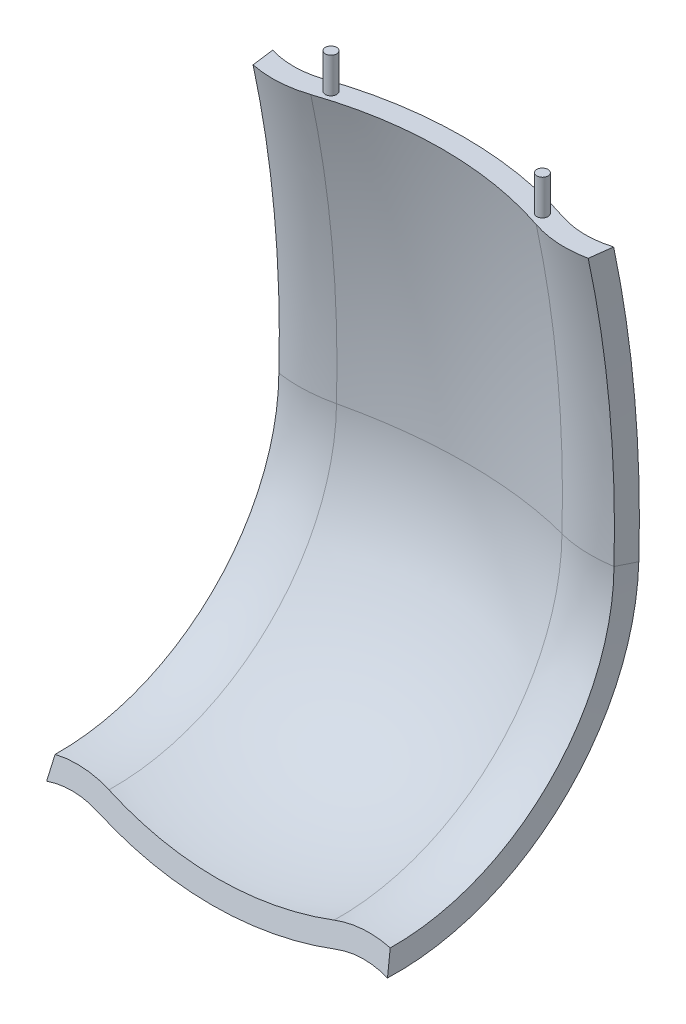
ISO-10303-21;
HEADER;
FILE_DESCRIPTION(('STEP AP214'),'2;1');
FILE_NAME('part.step','',(''),(''),'','','');
FILE_SCHEMA(('AUTOMOTIVE_DESIGN { 1 0 10303 214 1 1 1 1 }'));
ENDSEC;
DATA;
#1=APPLICATION_CONTEXT('core data for automotive mechanical design processes');
#2=APPLICATION_PROTOCOL_DEFINITION('international standard','automotive_design',2000,#1);
#3=PRODUCT_CONTEXT('',#1,'mechanical');
#4=PRODUCT('Part','Part','',(#3));
#5=PRODUCT_RELATED_PRODUCT_CATEGORY('part','',(#4));
#6=PRODUCT_DEFINITION_FORMATION('','',#4);
#7=PRODUCT_DEFINITION_CONTEXT('part definition',#1,'design');
#8=PRODUCT_DEFINITION('design','',#6,#7);
#9=PRODUCT_DEFINITION_SHAPE('','',#8);
#10=(LENGTH_UNIT() NAMED_UNIT(*) SI_UNIT(.MILLI.,.METRE.));
#11=(NAMED_UNIT(*) PLANE_ANGLE_UNIT() SI_UNIT($,.RADIAN.));
#12=(NAMED_UNIT(*) SI_UNIT($,.STERADIAN.) SOLID_ANGLE_UNIT());
#13=UNCERTAINTY_MEASURE_WITH_UNIT(LENGTH_MEASURE(1.E-05),#10,'distance_accuracy_value','');
#14=(GEOMETRIC_REPRESENTATION_CONTEXT(3) GLOBAL_UNCERTAINTY_ASSIGNED_CONTEXT((#13)) GLOBAL_UNIT_ASSIGNED_CONTEXT((#10,
#11,#12)) REPRESENTATION_CONTEXT('',''));
#15=CARTESIAN_POINT('',(0.,0.,0.));
#16=DIRECTION('',(0.,0.,1.));
#17=DIRECTION('',(1.,0.,0.));
#18=AXIS2_PLACEMENT_3D('',#15,#16,#17);
#19=CARTESIAN_POINT('',(-118.278717158602,-424.071503815942,169.727693219282));
#20=DIRECTION('',(0.,0.247759799276308,0.968821491226616));
#21=DIRECTION('',(0.,-0.968821491226616,0.247759799276308));
#22=AXIS2_PLACEMENT_3D('',#19,#20,#21);
#23=PLANE('',#22);
#24=CARTESIAN_POINT('',(-118.278717158602,-424.071503815942,169.727693219282));
#25=DIRECTION('',(0.,0.247759799276308,0.968821491226616));
#26=DIRECTION('',(0.,-0.968821491226616,0.247759799276308));
#27=AXIS2_PLACEMENT_3D('',#24,#25,#26);
#28=CIRCLE('',#27,59.5845550701935);
#29=CARTESIAN_POINT('',(-99.592921032926,-369.256749710492,155.709741927396));
#30=VERTEX_POINT('',#29);
#31=CARTESIAN_POINT('',(-135.591251757044,-368.835122514182,155.601917864374));
#32=VERTEX_POINT('',#31);
#33=EDGE_CURVE('E171',#30,#32,#28,.T.);
#34=ORIENTED_EDGE('',*,*,#33,.F.);
#35=CARTESIAN_POINT('',(-14.7418590538277,-126.038057965964,93.5106528355801));
#36=DIRECTION('',(0.,-0.247759799276308,-0.968821491226616));
#37=DIRECTION('',(0.,-0.968821491226616,0.247759799276308));
#38=AXIS2_PLACEMENT_3D('',#35,#36,#37);
#39=CIRCLE('',#38,264.997663040171);
#40=CARTESIAN_POINT('',(69.7900654553828,-369.361033084295,155.736410646036));
#41=VERTEX_POINT('',#40);
#42=EDGE_CURVE('E173',#41,#30,#39,.T.);
#43=ORIENTED_EDGE('',*,*,#42,.F.);
#44=CARTESIAN_POINT('',(88.7970903246977,-424.072266339678,169.7278882219));
#45=DIRECTION('',(0.,0.247759799276308,0.968821491226616));
#46=DIRECTION('',(0.,0.968821491226616,-0.247759799276308));
#47=AXIS2_PLACEMENT_3D('',#44,#45,#46);
#48=CIRCLE('',#47,59.5847923841612);
#49=CARTESIAN_POINT('',(106.171721078195,-368.853948331316,155.606732250426));
#50=VERTEX_POINT('',#49);
#51=EDGE_CURVE('E104',#50,#41,#48,.T.);
#52=ORIENTED_EDGE('',*,*,#51,.F.);
#53=DIRECTION('',(0.126241213779495,-0.961070507129327,0.245777615477199));
#54=VECTOR('',#53,1.);
#55=CARTESIAN_POINT('',(106.171721078195,-368.853948331316,155.606732250426));
#56=LINE('',#55,#54);
#57=CARTESIAN_POINT('',(104.135409966841,-353.351573996735,151.642260788734));
#58=VERTEX_POINT('',#57);
#59=EDGE_CURVE('E108',#58,#50,#56,.T.);
#60=ORIENTED_EDGE('',*,*,#59,.F.);
#61=CARTESIAN_POINT('',(88.7970903246977,-424.072266339678,169.7278882219));
#62=DIRECTION('',(0.,-0.247759799276308,-0.968821491226616));
#63=DIRECTION('',(0.,0.968821491226616,-0.247759799276308));
#64=AXIS2_PLACEMENT_3D('',#61,#62,#63);
#65=CIRCLE('',#64,74.5906850388244);
#66=CARTESIAN_POINT('',(65.0033176383462,-355.582502348779,152.212783187037));
#67=VERTEX_POINT('',#66);
#68=EDGE_CURVE('E113',#67,#58,#65,.T.);
#69=ORIENTED_EDGE('',*,*,#68,.F.);
#70=CARTESIAN_POINT('',(-14.7418590538277,-126.038057965964,93.5106528355801));
#71=DIRECTION('',(0.,0.247759799276308,0.968821491226616));
#72=DIRECTION('',(0.,-0.968821491226616,0.247759799276308));
#73=AXIS2_PLACEMENT_3D('',#70,#71,#72);
#74=CIRCLE('',#73,249.991770385508);
#75=CARTESIAN_POINT('',(-94.8062706017691,-355.478173938941,152.186102951189));
#76=VERTEX_POINT('',#75);
#77=EDGE_CURVE('E214',#76,#67,#74,.T.);
#78=ORIENTED_EDGE('',*,*,#77,.F.);
#79=CARTESIAN_POINT('',(-118.278717158602,-424.071503815942,169.727693219282));
#80=DIRECTION('',(0.,-0.247759799276308,-0.968821491226616));
#81=DIRECTION('',(0.,-0.968821491226616,0.247759799276308));
#82=AXIS2_PLACEMENT_3D('',#79,#80,#81);
#83=CIRCLE('',#82,74.5902677305294);
#84=CARTESIAN_POINT('',(-133.542450497735,-353.336079340013,151.638298290922));
#85=VERTEX_POINT('',#84);
#86=EDGE_CURVE('E164',#85,#76,#83,.T.);
#87=ORIENTED_EDGE('',*,*,#86,.F.);
#88=DIRECTION('',(0.127029944830027,0.960972954495393,-0.245752668032059));
#89=VECTOR('',#88,1.);
#90=CARTESIAN_POINT('',(-133.542450497735,-353.336079340013,151.638298290922));
#91=LINE('',#90,#89);
#92=EDGE_CURVE('E168',#32,#85,#91,.T.);
#93=ORIENTED_EDGE('',*,*,#92,.F.);
#94=EDGE_LOOP('',(#34,#43,#52,#60,#69,#78,#87,#93));
#95=FACE_BOUND('',#94,.T.);
#96=ADVANCED_FACE('F38',(#95),#23,.T.);
#97=CARTESIAN_POINT('',(-118.278717158602,0.,-61.7816368146099));
#98=DIRECTION('',(0.,-1.,0.));
#99=DIRECTION('',(0.,0.,-1.));
#100=AXIS2_PLACEMENT_3D('',#97,#98,#99);
#101=PLANE('',#100);
#102=CARTESIAN_POINT('',(60.3051011635703,0.,-0.141223037764587));
#103=DIRECTION('',(0.,-1.,0.));
#104=DIRECTION('',(0.,0.,-1.));
#105=AXIS2_PLACEMENT_3D('',#102,#103,#104);
#106=CIRCLE('',#105,4.00000000000001);
#107=CARTESIAN_POINT('',(60.3051011635703,0.,-4.14122303776459));
#108=VERTEX_POINT('',#107);
#109=EDGE_CURVE('E11',#108,#108,#106,.F.);
#110=ORIENTED_EDGE('',*,*,#109,.F.);
#111=EDGE_LOOP('',(#110));
#112=FACE_BOUND('',#111,.T.);
#113=CARTESIAN_POINT('',(-89.6435023296788,0.,-0.14072909963717));
#114=DIRECTION('',(0.,-1.,0.));
#115=DIRECTION('',(0.,0.,-1.));
#116=AXIS2_PLACEMENT_3D('',#113,#114,#115);
#117=CIRCLE('',#116,4.00000000000001);
#118=CARTESIAN_POINT('',(-89.6435023296788,0.,-4.14072909963718));
#119=VERTEX_POINT('',#118);
#120=EDGE_CURVE('E45',#119,#119,#117,.F.);
#121=ORIENTED_EDGE('',*,*,#120,.F.);
#122=EDGE_LOOP('',(#121));
#123=FACE_BOUND('',#122,.T.);
#124=CARTESIAN_POINT('',(-118.278717158602,0.,-61.7816368146099));
#125=DIRECTION('',(0.,-1.,0.));
#126=DIRECTION('',(0.,0.,-1.));
#127=AXIS2_PLACEMENT_3D('',#124,#125,#126);
#128=CIRCLE('',#127,59.5845550701935);
#129=CARTESIAN_POINT('',(-99.592921032926,0.,-5.20284020260518));
#130=VERTEX_POINT('',#129);
#131=CARTESIAN_POINT('',(-135.591251757044,0.,-4.76764424532323));
#132=VERTEX_POINT('',#131);
#133=EDGE_CURVE('E197',#130,#132,#128,.T.);
#134=ORIENTED_EDGE('',*,*,#133,.T.);
#135=DIRECTION('',(0.127029944830027,0.,0.991898882505914));
#136=VECTOR('',#135,1.);
#137=CARTESIAN_POINT('',(-133.542450497735,0.,11.2301874651869));
#138=LINE('',#137,#136);
#139=CARTESIAN_POINT('',(-133.542450497735,0.,11.2301874651869));
#140=VERTEX_POINT('',#139);
#141=EDGE_CURVE('E132',#132,#140,#138,.T.);
#142=ORIENTED_EDGE('',*,*,#141,.T.);
#143=CARTESIAN_POINT('',(-118.278717158602,0.,-61.7816368146099));
#144=DIRECTION('',(0.,1.,0.));
#145=DIRECTION('',(0.,0.,-1.));
#146=AXIS2_PLACEMENT_3D('',#143,#144,#145);
#147=CIRCLE('',#146,74.5902677305294);
#148=CARTESIAN_POINT('',(-94.8062706017691,0.,9.01915620883497));
#149=VERTEX_POINT('',#148);
#150=EDGE_CURVE('E128',#140,#149,#147,.T.);
#151=ORIENTED_EDGE('',*,*,#150,.T.);
#152=CARTESIAN_POINT('',(-14.7418590538277,0.,245.843089256073));
#153=DIRECTION('',(0.,-1.,0.));
#154=DIRECTION('',(0.,0.,-1.));
#155=AXIS2_PLACEMENT_3D('',#152,#153,#154);
#156=CIRCLE('',#155,249.991770385508);
#157=CARTESIAN_POINT('',(65.0033176383462,0.,8.91147031336038));
#158=VERTEX_POINT('',#157);
#159=EDGE_CURVE('E123',#149,#158,#156,.T.);
#160=ORIENTED_EDGE('',*,*,#159,.T.);
#161=CARTESIAN_POINT('',(88.7970903246977,0.,-61.7824238778026));
#162=DIRECTION('',(0.,1.,0.));
#163=DIRECTION('',(0.,0.,1.));
#164=AXIS2_PLACEMENT_3D('',#161,#162,#163);
#165=CIRCLE('',#164,74.5906850388244);
#166=CARTESIAN_POINT('',(104.135409966841,0.,11.2141941610939));
#167=VERTEX_POINT('',#166);
#168=EDGE_CURVE('E232',#158,#167,#165,.T.);
#169=ORIENTED_EDGE('',*,*,#168,.T.);
#170=DIRECTION('',(0.126241213779495,0.,-0.991999574568195));
#171=VECTOR('',#170,1.);
#172=CARTESIAN_POINT('',(106.171721078195,0.,-4.78707591287451));
#173=LINE('',#172,#171);
#174=CARTESIAN_POINT('',(106.171721078195,0.,-4.78707591287458));
#175=VERTEX_POINT('',#174);
#176=EDGE_CURVE('E58',#167,#175,#173,.T.);
#177=ORIENTED_EDGE('',*,*,#176,.T.);
#178=CARTESIAN_POINT('',(88.7970903246977,0.,-61.7824238778026));
#179=DIRECTION('',(0.,-1.,0.));
#180=DIRECTION('',(0.,0.,1.));
#181=AXIS2_PLACEMENT_3D('',#178,#179,#180);
#182=CIRCLE('',#181,59.5847923841612);
#183=CARTESIAN_POINT('',(69.7900654553828,0.,-5.31047961270002));
#184=VERTEX_POINT('',#183);
#185=EDGE_CURVE('E52',#175,#184,#182,.T.);
#186=ORIENTED_EDGE('',*,*,#185,.T.);
#187=CARTESIAN_POINT('',(-14.7418590538277,0.,245.843089256073));
#188=DIRECTION('',(0.,1.,0.));
#189=DIRECTION('',(0.,0.,-1.));
#190=AXIS2_PLACEMENT_3D('',#187,#188,#189);
#191=CIRCLE('',#190,264.997663040171);
#192=EDGE_CURVE('E254',#184,#130,#191,.T.);
#193=ORIENTED_EDGE('',*,*,#192,.T.);
#194=EDGE_LOOP('',(#134,#142,#151,#160,#169,#177,#186,#193));
#195=FACE_BOUND('',#194,.T.);
#196=ADVANCED_FACE('F262',(#112,#123,#195),#101,.F.);
#197=CARTESIAN_POINT('',(-99.592921032926,-369.256749710492,155.709741927396));
#198=CARTESIAN_POINT('',(-99.592921032926,-373.333889627721,54.1518202161446));
#199=CARTESIAN_POINT('',(-99.592921032926,-303.97058147765,-20.1406155676662));
#200=CARTESIAN_POINT('',(-99.592921032926,-202.372049393952,-23.0341965067791));
#201=CARTESIAN_POINT('',(-111.354236849151,-365.4935473196,154.747366218923));
#202=CARTESIAN_POINT('',(-111.354236849151,-369.001718573605,55.4142972496257));
#203=CARTESIAN_POINT('',(-111.354236849151,-300.82078636074,-16.9094632927526));
#204=CARTESIAN_POINT('',(-111.354236849151,-201.453585225683,-19.2600366253375));
#205=CARTESIAN_POINT('',(-123.739469592964,-365.348486400041,154.710269328899));
#206=CARTESIAN_POINT('',(-123.739469592964,-368.834725504532,55.4629622057922));
#207=CARTESIAN_POINT('',(-123.739469592964,-300.699370574763,-16.7849114160405));
#208=CARTESIAN_POINT('',(-123.739469592964,-201.418181002633,-19.1145533251865));
#209=CARTESIAN_POINT('',(-135.591251757044,-368.835122514182,155.601917864374));
#210=CARTESIAN_POINT('',(-135.591251757044,-372.848515484703,54.2932674721626));
#211=CARTESIAN_POINT('',(-135.591251757044,-303.617680106385,-19.7785989836475));
#212=CARTESIAN_POINT('',(-135.591251757044,-202.269145156562,-22.6113416390504));
#213=(BOUNDED_SURFACE() B_SPLINE_SURFACE(3,3,((#197,#198,#199,#200),(#201,#202,#203,#204),(#205,
#206,#207,#208),(#209,#210,#211,#212)),.UNSPECIFIED.,.F.,.F.,
.F.) B_SPLINE_SURFACE_WITH_KNOTS((4,4),(4,4),(0.,1.),(0.,1.),
.UNSPECIFIED.) GEOMETRIC_REPRESENTATION_ITEM() RATIONAL_B_SPLINE_SURFACE(((1.,0.801983569158669,
0.801983569158669,1.),(0.968850874498109,0.777002482312491,0.777002482312491,0.968850874498109),
(0.968850874498109,0.777002482312491,0.777002482312491,0.968850874498109),(1.,0.801983569158669,
0.801983569158669,1.))) REPRESENTATION_ITEM('') SURFACE());
#214=CARTESIAN_POINT('',(-135.591251757044,-197.477734141993,148.813509023892));
#215=DIRECTION('',(1.,0.,0.));
#216=DIRECTION('',(0.,-0.999216228439356,0.0395844517888995));
#217=AXIS2_PLACEMENT_3D('',#214,#215,#216);
#218=CIRCLE('',#217,171.491798766946);
#219=CARTESIAN_POINT('',(-135.591251757044,-202.269145156562,-22.6113416390504));
#220=VERTEX_POINT('',#219);
#221=EDGE_CURVE('E193',#32,#220,#218,.T.);
#222=CARTESIAN_POINT('',(-118.278717158602,-215.750385797051,-78.0085572683933));
#223=DIRECTION('',(0.,-0.9716424535963,0.23645494786399));
#224=DIRECTION('',(0.,-0.23645494786399,-0.9716424535963));
#225=AXIS2_PLACEMENT_3D('',#222,#223,#224);
#226=CIRCLE('',#225,59.5845550701935);
#227=CARTESIAN_POINT('',(-99.592921032926,-202.372049393952,-23.0341965067791));
#228=VERTEX_POINT('',#227);
#229=EDGE_CURVE('E191',#228,#220,#226,.T.);
#230=CARTESIAN_POINT('',(-99.592921032926,-197.477734141993,148.813509023892));
#231=DIRECTION('',(1.,0.,0.));
#232=DIRECTION('',(0.,-0.99919512386668,0.0401136440759395));
#233=AXIS2_PLACEMENT_3D('',#230,#231,#232);
#234=CIRCLE('',#233,171.917387770818);
#235=EDGE_CURVE('E184',#30,#228,#234,.T.);
#236=ORIENTED_EDGE('',*,*,#221,.T.);
#237=ORIENTED_EDGE('',*,*,#229,.F.);
#238=ORIENTED_EDGE('',*,*,#235,.F.);
#239=ORIENTED_EDGE('',*,*,#33,.T.);
#240=EDGE_LOOP('',(#236,#237,#238,#239));
#241=FACE_BOUND('',#240,.T.);
#242=ADVANCED_FACE('F189',(#241),#213,.T.);
#243=CARTESIAN_POINT('',(-135.591251757044,-368.835122514182,155.601917864374));
#244=CARTESIAN_POINT('',(-135.591251757044,-372.848515484703,54.2932674721626));
#245=CARTESIAN_POINT('',(-135.591251757044,-303.617680106385,-19.7785989836475));
#246=CARTESIAN_POINT('',(-135.591251757044,-202.269145156562,-22.6113416390504));
#247=CARTESIAN_POINT('',(-133.542450497735,-353.336079340013,151.638298290922));
#248=CARTESIAN_POINT('',(-133.542450497735,-355.006130401154,59.4928778082094));
#249=CARTESIAN_POINT('',(-133.542450497735,-290.645002733271,-6.47084579652049));
#250=CARTESIAN_POINT('',(-133.542450497735,-198.486378693517,-7.06716918362965));
#251=(BOUNDED_SURFACE() B_SPLINE_SURFACE(1,3,((#243,#244,#245,#246),(#247,#248,#249,#250)),
.UNSPECIFIED.,.F.,.F.,.F.) B_SPLINE_SURFACE_WITH_KNOTS((2,2),(4,4),(0.,1.),(0.,1.),
.UNSPECIFIED.) GEOMETRIC_REPRESENTATION_ITEM() RATIONAL_B_SPLINE_SURFACE(((1.,0.801983569158669,
0.801983569158669,1.),(1.,0.801983569158669,0.801983569158669,1.))) REPRESENTATION_ITEM('') SURFACE());
#252=CARTESIAN_POINT('',(-133.542450497735,-197.477734141993,148.813509023892));
#253=DIRECTION('',(1.,0.,0.));
#254=DIRECTION('',(0.,-0.999835799296297,0.0181211049755204));
#255=AXIS2_PLACEMENT_3D('',#252,#253,#254);
#256=CIRCLE('',#255,155.883941450902);
#257=CARTESIAN_POINT('',(-133.542450497735,-198.486378693517,-7.06716918362957));
#258=VERTEX_POINT('',#257);
#259=EDGE_CURVE('E207',#85,#258,#256,.T.);
#260=DIRECTION('',(0.127029944830027,0.234539398549286,0.963771063917474));
#261=VECTOR('',#260,1.);
#262=CARTESIAN_POINT('',(-133.542450497735,-198.486378693517,-7.06716918362962));
#263=LINE('',#262,#261);
#264=EDGE_CURVE('E205',#220,#258,#263,.T.);
#265=ORIENTED_EDGE('',*,*,#259,.T.);
#266=ORIENTED_EDGE('',*,*,#264,.F.);
#267=ORIENTED_EDGE('',*,*,#221,.F.);
#268=ORIENTED_EDGE('',*,*,#92,.T.);
#269=EDGE_LOOP('',(#265,#266,#267,#268));
#270=FACE_BOUND('',#269,.T.);
#271=ADVANCED_FACE('F400',(#270),#251,.T.);
#272=CARTESIAN_POINT('',(-133.542450497735,-353.336079340013,151.638298290922));
#273=CARTESIAN_POINT('',(-133.542450497735,-355.006130401154,59.4928778082094));
#274=CARTESIAN_POINT('',(-133.542450497735,-290.645002733271,-6.47084579652049));
#275=CARTESIAN_POINT('',(-133.542450497735,-198.486378693517,-7.06716918362965));
#276=CARTESIAN_POINT('',(-120.585800808495,-350.711836316675,150.967192281608));
#277=CARTESIAN_POINT('',(-120.585800808495,-351.985121036314,60.37325739004));
#278=CARTESIAN_POINT('',(-120.585800808495,-288.448515007683,-4.21762422244095));
#279=CARTESIAN_POINT('',(-120.585800808495,-197.845894091467,-4.43528503043938));
#280=CARTESIAN_POINT('',(-107.370551551793,-351.442634091063,151.154081519237));
#281=CARTESIAN_POINT('',(-107.370551551793,-352.826410086373,60.1280897613956));
#282=CARTESIAN_POINT('',(-107.370551551793,-289.060191718664,-4.84510014479115));
#283=CARTESIAN_POINT('',(-107.370551551793,-198.024255896202,-5.16821070252582));
#284=CARTESIAN_POINT('',(-94.8062706017691,-355.478173938941,152.186102951189));
#285=CARTESIAN_POINT('',(-94.8062706017691,-357.472094028067,58.774249110153));
#286=CARTESIAN_POINT('',(-94.8062706017691,-292.437932904656,-8.3100861874057));
#287=CARTESIAN_POINT('',(-94.8062706017691,-199.009187973963,-9.21550101852953));
#288=(BOUNDED_SURFACE() B_SPLINE_SURFACE(3,3,((#272,#273,#274,#275),(#276,#277,#278,#279),(#280,
#281,#282,#283),(#284,#285,#286,#287)),.UNSPECIFIED.,.F.,.F.,
.F.) B_SPLINE_SURFACE_WITH_KNOTS((4,4),(4,4),(0.,1.),(0.,1.),
.UNSPECIFIED.) GEOMETRIC_REPRESENTATION_ITEM() RATIONAL_B_SPLINE_SURFACE(((1.,0.801983569158669,
0.801983569158669,1.),(0.977057618400475,0.783584156078482,0.783584156078482,0.977057618400475),
(0.977057618400475,0.783584156078482,0.783584156078482,0.977057618400475),(1.,0.801983569158669,
0.801983569158669,1.))) REPRESENTATION_ITEM('') SURFACE());
#289=CARTESIAN_POINT('',(-94.8062706017691,-197.477734141993,148.813509023892));
#290=DIRECTION('',(1.,0.,0.));
#291=DIRECTION('',(0.,-0.999772263237142,0.021340610621128));
#292=AXIS2_PLACEMENT_3D('',#289,#290,#291);
#293=CIRCLE('',#292,158.036430502044);
#294=CARTESIAN_POINT('',(-94.8062706017691,-199.009187973963,-9.2155010185295));
#295=VERTEX_POINT('',#294);
#296=EDGE_CURVE('E216',#76,#295,#293,.T.);
#297=CARTESIAN_POINT('',(-118.278717158602,-215.750385797051,-78.0085572683933));
#298=DIRECTION('',(0.,0.9716424535963,-0.23645494786399));
#299=DIRECTION('',(0.,-0.23645494786399,-0.9716424535963));
#300=AXIS2_PLACEMENT_3D('',#297,#298,#299);
#301=CIRCLE('',#300,74.5902677305294);
#302=EDGE_CURVE('E210',#258,#295,#301,.T.);
#303=ORIENTED_EDGE('',*,*,#296,.T.);
#304=ORIENTED_EDGE('',*,*,#302,.F.);
#305=ORIENTED_EDGE('',*,*,#259,.F.);
#306=ORIENTED_EDGE('',*,*,#86,.T.);
#307=EDGE_LOOP('',(#303,#304,#305,#306));
#308=FACE_BOUND('',#307,.T.);
#309=ADVANCED_FACE('F289',(#308),#288,.T.);
#310=CARTESIAN_POINT('',(-94.8062706017691,-355.478173938941,152.186102951189));
#311=CARTESIAN_POINT('',(-94.806270601769,-357.472094028067,58.7742491101529));
#312=CARTESIAN_POINT('',(-94.806270601769,-292.437932904656,-8.31008618740575));
#313=CARTESIAN_POINT('',(-94.8062706017691,-199.009187973963,-9.21550101852958));
#314=CARTESIAN_POINT('',(-42.5135200471102,-372.605879037843,156.566225415231));
#315=CARTESIAN_POINT('',(-42.5135200471102,-377.189382801183,53.0282561824453));
#316=CARTESIAN_POINT('',(-42.5135200471102,-306.773798021815,-23.0162373708514));
#317=CARTESIAN_POINT('',(-42.5135200471102,-203.189453020585,-26.3930776489781));
#318=CARTESIAN_POINT('',(12.6867891166641,-372.641915426779,156.575441115512));
#319=CARTESIAN_POINT('',(12.6867891166641,-377.23086762842,53.0161667148386));
#320=CARTESIAN_POINT('',(12.6867891166641,-306.803960428752,-23.0471788531309));
#321=CARTESIAN_POINT('',(12.6867891166641,-203.198248224391,-26.4292189667359));
#322=CARTESIAN_POINT('',(65.0033176383462,-355.582502348779,152.212783187037));
#323=CARTESIAN_POINT('',(65.0033176383462,-357.59219613002,58.7392490735675));
#324=CARTESIAN_POINT('',(65.0033176383462,-292.525255637193,-8.39966440929496));
#325=CARTESIAN_POINT('',(65.0033176383462,-199.034650836763,-9.32013320622621));
#326=(BOUNDED_SURFACE() B_SPLINE_SURFACE(3,3,((#310,#311,#312,#313),(#314,#315,#316,#317),(#318,
#319,#320,#321),(#322,#323,#324,#325)),.UNSPECIFIED.,.F.,.F.,
.F.) B_SPLINE_SURFACE_WITH_KNOTS((4,4),(4,4),(0.,1.),(0.,1.),
.UNSPECIFIED.) GEOMETRIC_REPRESENTATION_ITEM() RATIONAL_B_SPLINE_SURFACE(((1.,0.801983569158669,
0.801983569158669,1.),(0.965028340487339,0.773936872843304,0.773936872843304,0.965028340487339),
(0.965028340487339,0.773936872843304,0.773936872843304,0.965028340487339),(1.,0.801983569158669,
0.801983569158669,1.))) REPRESENTATION_ITEM('') SURFACE());
#327=CARTESIAN_POINT('',(65.0033176383462,-197.477734141993,148.813509023892));
#328=DIRECTION('',(1.,0.,0.));
#329=DIRECTION('',(0.,-0.999768952155682,0.0214951693533507));
#330=AXIS2_PLACEMENT_3D('',#327,#328,#329);
#331=CIRCLE('',#330,158.14130641473);
#332=CARTESIAN_POINT('',(65.0033176383462,-199.034650836763,-9.32013320622613));
#333=VERTEX_POINT('',#332);
#334=EDGE_CURVE('E224',#67,#333,#331,.T.);
#335=CARTESIAN_POINT('',(-14.7418590538277,-143.010997232333,220.892686357814));
#336=DIRECTION('',(0.,-0.9716424535963,0.23645494786399));
#337=DIRECTION('',(0.,-0.23645494786399,-0.9716424535963));
#338=AXIS2_PLACEMENT_3D('',#335,#336,#337);
#339=CIRCLE('',#338,249.991770385508);
#340=EDGE_CURVE('E219',#295,#333,#339,.T.);
#341=ORIENTED_EDGE('',*,*,#334,.T.);
#342=ORIENTED_EDGE('',*,*,#340,.F.);
#343=ORIENTED_EDGE('',*,*,#296,.F.);
#344=ORIENTED_EDGE('',*,*,#77,.T.);
#345=EDGE_LOOP('',(#341,#342,#343,#344));
#346=FACE_BOUND('',#345,.T.);
#347=ADVANCED_FACE('F287',(#346),#326,.T.);
#348=CARTESIAN_POINT('',(65.0033176383462,-355.582502348779,152.212783187037));
#349=CARTESIAN_POINT('',(65.0033176383462,-357.59219613002,58.7392490735675));
#350=CARTESIAN_POINT('',(65.0033176383462,-292.525255637193,-8.399664409295));
#351=CARTESIAN_POINT('',(65.0033176383462,-199.034650836763,-9.32013320622627));
#352=CARTESIAN_POINT('',(77.6843614537829,-351.447458017271,151.155315157219));
#353=CARTESIAN_POINT('',(77.6843614537829,-352.831963354924,60.1264714333293));
#354=CARTESIAN_POINT('',(77.6843614537829,-289.064229338126,-4.84924205333642));
#355=CARTESIAN_POINT('',(77.6843614537829,-198.025433245415,-5.1730486747828));
#356=CARTESIAN_POINT('',(91.0413044246165,-350.68597604692,150.960578952629));
#357=CARTESIAN_POINT('',(91.0413044246165,-351.955350883011,60.381932978875));
#358=CARTESIAN_POINT('',(91.0413044246165,-288.42686999821,-4.19542013646015));
#359=CARTESIAN_POINT('',(91.0413044246165,-197.839582517258,-4.40934946213967));
#360=CARTESIAN_POINT('',(104.135409966841,-353.351573996735,151.642260788734));
#361=CARTESIAN_POINT('',(104.135409966841,-355.023967736584,59.4876796694382));
#362=CARTESIAN_POINT('',(104.135409966841,-290.657971739189,-6.48414978342118));
#363=CARTESIAN_POINT('',(104.135409966841,-198.490160389402,-7.0827089568597));
#364=(BOUNDED_SURFACE() B_SPLINE_SURFACE(3,3,((#348,#349,#350,#351),(#352,#353,#354,#355),(#356,
#357,#358,#359),(#360,#361,#362,#363)),.UNSPECIFIED.,.F.,.F.,
.F.) B_SPLINE_SURFACE_WITH_KNOTS((4,4),(4,4),(0.,1.),(0.,1.),
.UNSPECIFIED.) GEOMETRIC_REPRESENTATION_ITEM() RATIONAL_B_SPLINE_SURFACE(((1.,0.801983569158669,
0.801983569158669,1.),(0.976573068002766,0.78319555462109,0.78319555462109,0.976573068002766),
(0.976573068002766,0.78319555462109,0.78319555462109,0.976573068002766),(1.,0.801983569158669,
0.801983569158669,1.))) REPRESENTATION_ITEM('') SURFACE());
#365=CARTESIAN_POINT('',(104.135409966841,-197.477734141993,148.813509023892));
#366=DIRECTION('',(1.,0.,0.));
#367=DIRECTION('',(0.,-0.999835371145804,0.0181447128864944));
#368=AXIS2_PLACEMENT_3D('',#365,#366,#367);
#369=CIRCLE('',#368,155.899505411687);
#370=CARTESIAN_POINT('',(104.135409966841,-198.490160389402,-7.08270895685967));
#371=VERTEX_POINT('',#370);
#372=EDGE_CURVE('E236',#58,#371,#369,.T.);
#373=CARTESIAN_POINT('',(88.7970903246977,-215.750571902037,-78.009322012405));
#374=DIRECTION('',(0.,0.9716424535963,-0.23645494786399));
#375=DIRECTION('',(0.,0.23645494786399,0.9716424535963));
#376=AXIS2_PLACEMENT_3D('',#373,#374,#375);
#377=CIRCLE('',#376,74.5906850388244);
#378=EDGE_CURVE('E227',#333,#371,#377,.T.);
#379=ORIENTED_EDGE('',*,*,#372,.T.);
#380=ORIENTED_EDGE('',*,*,#378,.F.);
#381=ORIENTED_EDGE('',*,*,#334,.F.);
#382=ORIENTED_EDGE('',*,*,#68,.T.);
#383=EDGE_LOOP('',(#379,#380,#381,#382));
#384=FACE_BOUND('',#383,.T.);
#385=ADVANCED_FACE('F280',(#384),#364,.T.);
#386=CARTESIAN_POINT('',(104.135409966841,-353.351573996735,151.642260788734));
#387=CARTESIAN_POINT('',(104.135409966841,-355.023967736584,59.4876796694382));
#388=CARTESIAN_POINT('',(104.135409966841,-290.657971739189,-6.48414978342118));
#389=CARTESIAN_POINT('',(104.135409966841,-198.490160389402,-7.0827089568597));
#390=CARTESIAN_POINT('',(106.171721078195,-368.853948331316,155.606732250426));
#391=CARTESIAN_POINT('',(106.171721078195,-372.870187627625,54.286951797559));
#392=CARTESIAN_POINT('',(106.171721078195,-303.633437288891,-19.794763163923));
#393=CARTESIAN_POINT('',(106.171721078195,-202.2737398705,-22.6302222721874));
#394=(BOUNDED_SURFACE() B_SPLINE_SURFACE(1,3,((#386,#387,#388,#389),(#390,#391,#392,#393)),
.UNSPECIFIED.,.F.,.F.,.F.) B_SPLINE_SURFACE_WITH_KNOTS((2,2),(4,4),(0.,1.),(0.,1.),
.UNSPECIFIED.) GEOMETRIC_REPRESENTATION_ITEM() RATIONAL_B_SPLINE_SURFACE(((1.,0.801983569158669,
0.801983569158669,1.),(1.,0.801983569158669,0.801983569158669,1.))) REPRESENTATION_ITEM('') SURFACE());
#395=CARTESIAN_POINT('',(106.171721078195,-197.477734141993,148.813509023892));
#396=DIRECTION('',(1.,0.,0.));
#397=DIRECTION('',(0.,-0.999215289869343,0.0396081366807971));
#398=AXIS2_PLACEMENT_3D('',#395,#396,#397);
#399=CIRCLE('',#398,171.510800451955);
#400=CARTESIAN_POINT('',(106.171721078195,-202.2737398705,-22.6302222721874));
#401=VERTEX_POINT('',#400);
#402=EDGE_CURVE('E244',#50,#401,#399,.T.);
#403=DIRECTION('',(0.126241213779495,-0.234563207685623,-0.963868900599927));
#404=VECTOR('',#403,1.);
#405=CARTESIAN_POINT('',(106.171721078195,-202.2737398705,-22.6302222721874));
#406=LINE('',#405,#404);
#407=EDGE_CURVE('E239',#371,#401,#406,.T.);
#408=ORIENTED_EDGE('',*,*,#402,.T.);
#409=ORIENTED_EDGE('',*,*,#407,.F.);
#410=ORIENTED_EDGE('',*,*,#372,.F.);
#411=ORIENTED_EDGE('',*,*,#59,.T.);
#412=EDGE_LOOP('',(#408,#409,#410,#411));
#413=FACE_BOUND('',#412,.T.);
#414=ADVANCED_FACE('F277',(#413),#394,.T.);
#415=CARTESIAN_POINT('',(106.171721078195,-368.853948331316,155.606732250426));
#416=CARTESIAN_POINT('',(106.171721078195,-372.870187627625,54.286951797559));
#417=CARTESIAN_POINT('',(106.171721078195,-303.633437288891,-19.794763163923));
#418=CARTESIAN_POINT('',(106.171721078195,-202.2737398705,-22.6302222721874));
#419=CARTESIAN_POINT('',(94.1888605247667,-365.3149492997,154.701692779634));
#420=CARTESIAN_POINT('',(94.1888605247667,-368.796117840037,55.4742132134585));
#421=CARTESIAN_POINT('',(94.1888605247667,-300.67130006887,-16.7561158672487));
#422=CARTESIAN_POINT('',(94.1888605247667,-201.409995786487,-19.0809185733186));
#423=CARTESIAN_POINT('',(81.6628841585178,-365.489535406978,154.746340239756));
#424=CARTESIAN_POINT('',(81.6628841585178,-368.997100089152,55.4156431638284));
#425=CARTESIAN_POINT('',(81.6628841585178,-300.817428395508,-16.9060185934648));
#426=CARTESIAN_POINT('',(81.6628841585178,-201.452606060173,-19.2560130310437));
#427=CARTESIAN_POINT('',(69.7900654553829,-369.361033084295,155.736410646036));
#428=CARTESIAN_POINT('',(69.7900654553829,-373.45393988452,54.1168352882229));
#429=CARTESIAN_POINT('',(69.7900654553829,-304.057866515089,-20.2301551208176));
#430=CARTESIAN_POINT('',(69.7900654553829,-202.397501265054,-23.1387835273074));
#431=(BOUNDED_SURFACE() B_SPLINE_SURFACE(3,3,((#415,#416,#417,#418),(#419,#420,#421,#422),(#423,
#424,#425,#426),(#427,#428,#429,#430)),.UNSPECIFIED.,.F.,.F.,
.F.) B_SPLINE_SURFACE_WITH_KNOTS((4,4),(4,4),(0.,1.),(0.,1.),
.UNSPECIFIED.) GEOMETRIC_REPRESENTATION_ITEM() RATIONAL_B_SPLINE_SURFACE(((1.,0.801983569158669,
0.801983569158669,1.),(0.968165529484314,0.776452846872223,0.776452846872223,0.968165529484314),
(0.968165529484314,0.776452846872223,0.776452846872223,0.968165529484314),(1.,0.801983569158669,
0.801983569158669,1.))) REPRESENTATION_ITEM('') SURFACE());
#432=CARTESIAN_POINT('',(69.7900654553828,-197.477734141993,148.813509023892));
#433=DIRECTION('',(1.,0.,0.));
#434=DIRECTION('',(0.,-0.999189876992796,0.0402441264673685));
#435=AXIS2_PLACEMENT_3D('',#432,#433,#434);
#436=CIRCLE('',#435,172.022658455677);
#437=CARTESIAN_POINT('',(69.7900654553828,-202.397501265054,-23.1387835273073));
#438=VERTEX_POINT('',#437);
#439=EDGE_CURVE('E186',#41,#438,#436,.T.);
#440=CARTESIAN_POINT('',(88.7970903246977,-215.750571902037,-78.009322012405));
#441=DIRECTION('',(0.,-0.9716424535963,0.23645494786399));
#442=DIRECTION('',(0.,0.23645494786399,0.9716424535963));
#443=AXIS2_PLACEMENT_3D('',#440,#441,#442);
#444=CIRCLE('',#443,59.5847923841612);
#445=EDGE_CURVE('E247',#401,#438,#444,.T.);
#446=ORIENTED_EDGE('',*,*,#439,.T.);
#447=ORIENTED_EDGE('',*,*,#445,.F.);
#448=ORIENTED_EDGE('',*,*,#402,.F.);
#449=ORIENTED_EDGE('',*,*,#51,.T.);
#450=EDGE_LOOP('',(#446,#447,#448,#449));
#451=FACE_BOUND('',#450,.T.);
#452=ADVANCED_FACE('F271',(#451),#431,.T.);
#453=CARTESIAN_POINT('',(69.7900654553829,-369.361033084295,155.736410646036));
#454=CARTESIAN_POINT('',(69.7900654553829,-373.45393988452,54.116835288223));
#455=CARTESIAN_POINT('',(69.7900654553829,-304.057866515089,-20.2301551208175));
#456=CARTESIAN_POINT('',(69.7900654553829,-202.397501265054,-23.1387835273073));
#457=CARTESIAN_POINT('',(14.339984731215,-387.442237227839,160.360374451387));
#458=CARTESIAN_POINT('',(14.339984731215,-394.268889780334,48.0509630342745));
#459=CARTESIAN_POINT('',(14.339984731215,-319.191808993714,-35.7549974845939));
#460=CARTESIAN_POINT('',(14.339984731215,-206.810481594038,-41.2726355496907));
#461=CARTESIAN_POINT('',(-44.1666051073462,-387.406216700012,160.351162807317));
#462=CARTESIAN_POINT('',(-44.1666051073462,-394.227423212291,48.0630471808047));
#463=CARTESIAN_POINT('',(-44.1666051073462,-319.161659862504,-35.7240696209449));
#464=CARTESIAN_POINT('',(-44.1666051073462,-206.801690261366,-41.2365101392268));
#465=CARTESIAN_POINT('',(-99.5929210329259,-369.256749710492,155.709741927396));
#466=CARTESIAN_POINT('',(-99.5929210329259,-373.333889627721,54.1518202161446));
#467=CARTESIAN_POINT('',(-99.5929210329259,-303.97058147765,-20.1406155676662));
#468=CARTESIAN_POINT('',(-99.5929210329259,-202.372049393952,-23.0341965067791));
#469=(BOUNDED_SURFACE() B_SPLINE_SURFACE(3,3,((#453,#454,#455,#456),(#457,#458,#459,#460),(#461,
#462,#463,#464),(#465,#466,#467,#468)),.UNSPECIFIED.,.F.,.F.,
.F.) B_SPLINE_SURFACE_WITH_KNOTS((4,4),(4,4),(0.,1.),(0.,1.),
.UNSPECIFIED.) GEOMETRIC_REPRESENTATION_ITEM() RATIONAL_B_SPLINE_SURFACE(((1.,0.801983569158669,
0.801983569158669,1.),(0.96503651386788,0.773943427760202,0.773943427760202,0.96503651386788),
(0.96503651386788,0.773943427760202,0.773943427760202,0.96503651386788),(1.,0.801983569158669,
0.801983569158669,1.))) REPRESENTATION_ITEM('') SURFACE());
#470=CARTESIAN_POINT('',(-14.7418590538277,-143.010997232333,220.892686357814));
#471=DIRECTION('',(0.,0.9716424535963,-0.23645494786399));
#472=DIRECTION('',(0.,-0.23645494786399,-0.9716424535963));
#473=AXIS2_PLACEMENT_3D('',#470,#471,#472);
#474=CIRCLE('',#473,264.997663040171);
#475=EDGE_CURVE('E203',#438,#228,#474,.T.);
#476=ORIENTED_EDGE('',*,*,#475,.F.);
#477=ORIENTED_EDGE('',*,*,#439,.F.);
#478=ORIENTED_EDGE('',*,*,#42,.T.);
#479=ORIENTED_EDGE('',*,*,#235,.T.);
#480=EDGE_LOOP('',(#476,#477,#478,#479));
#481=FACE_BOUND('',#480,.T.);
#482=ADVANCED_FACE('F183',(#481),#469,.T.);
#483=CARTESIAN_POINT('',(-99.592921032926,-202.372049393952,-23.0341965067789));
#484=CARTESIAN_POINT('',(-99.592921032926,-134.364314366787,-25.1753154863117));
#485=CARTESIAN_POINT('',(-99.592921032926,-66.5854807019978,-19.2032035440865));
#486=CARTESIAN_POINT('',(-99.592921032926,0.,-5.20284020260502));
#487=CARTESIAN_POINT('',(-111.354236849151,-201.453585225683,-19.2600366253373));
#488=CARTESIAN_POINT('',(-111.354236849151,-133.746882555434,-21.3278975972599));
#489=CARTESIAN_POINT('',(-111.354236849151,-66.275662665742,-15.3188941795949));
#490=CARTESIAN_POINT('',(-111.354236849151,0.,-1.31853083811351));
#491=CARTESIAN_POINT('',(-123.739469592964,-201.418181002633,-19.1145533251863));
#492=CARTESIAN_POINT('',(-123.739469592964,-133.723082287201,-21.1795904059531));
#493=CARTESIAN_POINT('',(-123.739469592964,-66.2637200475762,-15.1691649251634));
#494=CARTESIAN_POINT('',(-123.739469592964,0.,-1.16880158368192));
#495=CARTESIAN_POINT('',(-135.591251757044,-202.269145156562,-22.6113416390503));
#496=CARTESIAN_POINT('',(-135.591251757044,-134.295137634713,-24.7442528303358));
#497=CARTESIAN_POINT('',(-135.591251757044,-66.5507688538365,-18.7680075868045));
#498=CARTESIAN_POINT('',(-135.591251757044,0.,-4.76764424532304));
#499=(BOUNDED_SURFACE() B_SPLINE_SURFACE(3,3,((#483,#484,#485,#486),(#487,#488,#489,#490),(#491,
#492,#493,#494),(#495,#496,#497,#498)),.UNSPECIFIED.,.F.,.F.,
.F.) B_SPLINE_SURFACE_WITH_KNOTS((4,4),(4,4),(0.,1.),(0.,1.),
.UNSPECIFIED.) GEOMETRIC_REPRESENTATION_ITEM() RATIONAL_B_SPLINE_SURFACE(((1.,0.995256869299418,
0.995256869299418,1.),(0.968850874498109,0.964255488170991,0.964255488170991,0.968850874498109),
(0.968850874498109,0.964255488170991,0.964255488170991,0.968850874498109),(1.,0.995256869299418,
0.995256869299418,1.))) REPRESENTATION_ITEM('') SURFACE());
#500=CARTESIAN_POINT('',(-135.591251757044,-175.528006990224,829.605259918528));
#501=DIRECTION('',(1.,0.,0.));
#502=DIRECTION('',(0.,-0.0313628990208982,-0.999508063281635));
#503=AXIS2_PLACEMENT_3D('',#500,#501,#502);
#504=CIRCLE('',#503,852.636044535287);
#505=EDGE_CURVE('E155',#220,#132,#504,.T.);
#506=CARTESIAN_POINT('',(-99.592921032926,-175.528006990224,829.605259918528));
#507=DIRECTION('',(1.,0.,0.));
#508=DIRECTION('',(0.,-0.0314678708137524,-0.999504763923839));
#509=AXIS2_PLACEMENT_3D('',#506,#507,#508);
#510=CIRCLE('',#509,853.061923465006);
#511=EDGE_CURVE('E199',#228,#130,#510,.T.);
#512=ORIENTED_EDGE('',*,*,#505,.T.);
#513=ORIENTED_EDGE('',*,*,#133,.F.);
#514=ORIENTED_EDGE('',*,*,#511,.F.);
#515=ORIENTED_EDGE('',*,*,#229,.T.);
#516=EDGE_LOOP('',(#512,#513,#514,#515));
#517=FACE_BOUND('',#516,.T.);
#518=ADVANCED_FACE('F268',(#517),#499,.T.);
#519=CARTESIAN_POINT('',(-135.591251757044,-202.269145156562,-22.6113416390503));
#520=CARTESIAN_POINT('',(-135.591251757044,-134.295137634713,-24.7442528303358));
#521=CARTESIAN_POINT('',(-135.591251757044,-66.5507688538365,-18.7680075868045));
#522=CARTESIAN_POINT('',(-135.591251757044,0.,-4.76764424532305));
#523=CARTESIAN_POINT('',(-133.542450497735,-198.486378693517,-7.06716918362947));
#524=CARTESIAN_POINT('',(-133.542450497735,-131.752196461946,-8.89836154481651));
#525=CARTESIAN_POINT('',(-133.542450497735,-65.2747590565197,-2.77017587629428));
#526=CARTESIAN_POINT('',(-133.542450497735,0.,11.2301874651872));
#527=(BOUNDED_SURFACE() B_SPLINE_SURFACE(1,3,((#519,#520,#521,#522),(#523,#524,#525,#526)),
.UNSPECIFIED.,.F.,.F.,.F.) B_SPLINE_SURFACE_WITH_KNOTS((2,2),(4,4),(0.,1.),(0.,1.),
.UNSPECIFIED.) GEOMETRIC_REPRESENTATION_ITEM() RATIONAL_B_SPLINE_SURFACE(((1.,0.995256869299418,
0.995256869299418,1.),(1.,0.995256869299418,0.995256869299418,1.))) REPRESENTATION_ITEM('') SURFACE());
#528=CARTESIAN_POINT('',(-133.542450497735,-175.528006990224,829.605259918528));
#529=DIRECTION('',(1.,0.,0.));
#530=DIRECTION('',(0.,-0.0274297711126821,-0.99962373303994));
#531=AXIS2_PLACEMENT_3D('',#528,#529,#530);
#532=CIRCLE('',#531,836.987359791635);
#533=EDGE_CURVE('E148',#258,#140,#532,.T.);
#534=ORIENTED_EDGE('',*,*,#533,.T.);
#535=ORIENTED_EDGE('',*,*,#141,.F.);
#536=ORIENTED_EDGE('',*,*,#505,.F.);
#537=ORIENTED_EDGE('',*,*,#264,.T.);
#538=EDGE_LOOP('',(#534,#535,#536,#537));
#539=FACE_BOUND('',#538,.T.);
#540=ADVANCED_FACE('F267',(#539),#527,.T.);
#541=CARTESIAN_POINT('',(-133.542450497735,-198.486378693517,-7.06716918362947));
#542=CARTESIAN_POINT('',(-133.542450497735,-131.752196461946,-8.89836154481651));
#543=CARTESIAN_POINT('',(-133.542450497735,-65.2747590565197,-2.77017587629428));
#544=CARTESIAN_POINT('',(-133.542450497735,0.,11.2301874651872));
#545=CARTESIAN_POINT('',(-120.585800808495,-197.845894091467,-4.43528503043923));
#546=CARTESIAN_POINT('',(-120.585800808495,-131.321634681041,-6.21539142935117));
#547=CARTESIAN_POINT('',(-120.585800808495,-65.0587096029702,-0.0614797469218435));
#548=CARTESIAN_POINT('',(-120.585800808495,0.,13.9388835945596));
#549=CARTESIAN_POINT('',(-107.370551551793,-198.024255896202,-5.16821070252563));
#550=CARTESIAN_POINT('',(-107.370551551793,-131.441537292355,-6.96254349251533));
#551=CARTESIAN_POINT('',(-107.370551551793,-65.118874937662,-0.815795976491323));
#552=CARTESIAN_POINT('',(-107.370551551793,0.,13.1845673649901));
#553=CARTESIAN_POINT('',(-94.8062706017691,-199.009187973963,-9.21550101852938));
#554=CARTESIAN_POINT('',(-94.8062706017691,-132.103651741498,-11.088393391071));
#555=CARTESIAN_POINT('',(-94.8062706017691,-65.4511140523924,-4.98120713264623));
#556=CARTESIAN_POINT('',(-94.8062706017691,0.,9.01915620883521));
#557=(BOUNDED_SURFACE() B_SPLINE_SURFACE(3,3,((#541,#542,#543,#544),(#545,#546,#547,#548),(#549,
#550,#551,#552),(#553,#554,#555,#556)),.UNSPECIFIED.,.F.,.F.,
.F.) B_SPLINE_SURFACE_WITH_KNOTS((4,4),(4,4),(0.,1.),(0.,1.),
.UNSPECIFIED.) GEOMETRIC_REPRESENTATION_ITEM() RATIONAL_B_SPLINE_SURFACE(((1.,0.995256869299418,
0.995256869299418,1.),(0.977057618400475,0.972423306414403,0.972423306414403,0.977057618400475),
(0.977057618400475,0.972423306414403,0.972423306414403,0.977057618400475),(1.,0.995256869299418,
0.995256869299418,1.))) REPRESENTATION_ITEM('') SURFACE());
#558=CARTESIAN_POINT('',(-94.8062706017691,-175.528006990224,829.605259918528));
#559=DIRECTION('',(1.,0.,0.));
#560=DIRECTION('',(0.,-0.0279821237182856,-0.999608423710112));
#561=AXIS2_PLACEMENT_3D('',#558,#559,#560);
#562=CIRCLE('',#561,839.149351926947);
#563=EDGE_CURVE('E141',#295,#149,#562,.T.);
#564=ORIENTED_EDGE('',*,*,#563,.T.);
#565=ORIENTED_EDGE('',*,*,#150,.F.);
#566=ORIENTED_EDGE('',*,*,#533,.F.);
#567=ORIENTED_EDGE('',*,*,#302,.T.);
#568=EDGE_LOOP('',(#564,#565,#566,#567));
#569=FACE_BOUND('',#568,.T.);
#570=ADVANCED_FACE('F291',(#569),#557,.T.);
#571=CARTESIAN_POINT('',(-94.8062706017691,-199.009187973963,-9.2155010185294));
#572=CARTESIAN_POINT('',(-94.8062706017691,-132.103651741498,-11.0883933910711));
#573=CARTESIAN_POINT('',(-94.8062706017691,-65.4511140523924,-4.98120713264625));
#574=CARTESIAN_POINT('',(-94.8062706017691,0.,9.01915620883519));
#575=CARTESIAN_POINT('',(-42.5135200471102,-203.189453020585,-26.3930776489779));
#576=CARTESIAN_POINT('',(-42.5135200471102,-134.913808859043,-28.5993939036677));
#577=CARTESIAN_POINT('',(-42.5135200471102,-66.8612088089626,-22.6601141903503));
#578=CARTESIAN_POINT('',(-42.5135200471102,0.,-8.65975084886887));
#579=CARTESIAN_POINT('',(12.6867891166641,-203.198248224391,-26.4292189667357));
#580=CARTESIAN_POINT('',(12.6867891166641,-134.919721379972,-28.636236739383));
#581=CARTESIAN_POINT('',(12.6867891166641,-66.8641756234186,-22.6973102984702));
#582=CARTESIAN_POINT('',(12.6867891166641,0.,-8.69694695698872));
#583=CARTESIAN_POINT('',(65.0033176383462,-199.034650836763,-9.32013320622601));
#584=CARTESIAN_POINT('',(65.0033176383462,-132.120768992278,-11.1950565328988));
#585=CARTESIAN_POINT('',(65.0033176383462,-65.4597032324853,-5.0888930281208));
#586=CARTESIAN_POINT('',(65.0033176383462,0.,8.91147031336064));
#587=(BOUNDED_SURFACE() B_SPLINE_SURFACE(3,3,((#571,#572,#573,#574),(#575,#576,#577,#578),(#579,
#580,#581,#582),(#583,#584,#585,#586)),.UNSPECIFIED.,.F.,.F.,
.F.) B_SPLINE_SURFACE_WITH_KNOTS((4,4),(4,4),(0.,1.),(0.,1.),
.UNSPECIFIED.) GEOMETRIC_REPRESENTATION_ITEM() RATIONAL_B_SPLINE_SURFACE(((1.,0.995256869299418,
0.995256869299418,1.),(0.965028340487339,0.960451084938642,0.960451084938642,0.965028340487339),
(0.965028340487339,0.960451084938642,0.960451084938642,0.965028340487339),(1.,0.995256869299418,
0.995256869299418,1.))) REPRESENTATION_ITEM('') SURFACE());
#588=CARTESIAN_POINT('',(65.0033176383462,-175.528006990224,829.605259918528));
#589=DIRECTION('',(1.,0.,0.));
#590=DIRECTION('',(0.,-0.0280089525626986,-0.999607672327669));
#591=AXIS2_PLACEMENT_3D('',#588,#589,#590);
#592=CIRCLE('',#591,839.254655950416);
#593=EDGE_CURVE('E229',#333,#158,#592,.T.);
#594=ORIENTED_EDGE('',*,*,#593,.T.);
#595=ORIENTED_EDGE('',*,*,#159,.F.);
#596=ORIENTED_EDGE('',*,*,#563,.F.);
#597=ORIENTED_EDGE('',*,*,#340,.T.);
#598=EDGE_LOOP('',(#594,#595,#596,#597));
#599=FACE_BOUND('',#598,.T.);
#600=ADVANCED_FACE('F284',(#599),#587,.T.);
#601=CARTESIAN_POINT('',(65.0033176383462,-199.034650836763,-9.32013320622608));
#602=CARTESIAN_POINT('',(65.0033176383462,-132.120768992279,-11.1950565328988));
#603=CARTESIAN_POINT('',(65.0033176383462,-65.4597032324854,-5.08889302812087));
#604=CARTESIAN_POINT('',(65.0033176383462,0.,8.91147031336057));
#605=CARTESIAN_POINT('',(77.6843614537829,-198.025433245415,-5.1730486747826));
#606=CARTESIAN_POINT('',(77.6843614537829,-131.442328758024,-6.96747537181905));
#607=CARTESIAN_POINT('',(77.6843614537829,-65.1192720832815,-0.820775145772227));
#608=CARTESIAN_POINT('',(77.6843614537829,0.,13.1795881957092));
#609=CARTESIAN_POINT('',(91.0413044246165,-197.839582517258,-4.4093494621395));
#610=CARTESIAN_POINT('',(91.0413044246165,-131.317391764625,-6.18895244092098));
#611=CARTESIAN_POINT('',(91.0413044246165,-65.0565805710552,-0.0347872447532312));
#612=CARTESIAN_POINT('',(91.0413044246165,0.,13.9655760967282));
#613=CARTESIAN_POINT('',(104.135409966841,-198.490160389402,-7.08270895685956));
#614=CARTESIAN_POINT('',(104.135409966841,-131.754738683429,-8.91420295148591));
#615=CARTESIAN_POINT('',(104.135409966841,-65.2760347051879,-2.78616918038734));
#616=CARTESIAN_POINT('',(104.135409966841,0.,11.2141941610941));
#617=(BOUNDED_SURFACE() B_SPLINE_SURFACE(3,3,((#601,#602,#603,#604),(#605,#606,#607,#608),(#609,
#610,#611,#612),(#613,#614,#615,#616)),.UNSPECIFIED.,.F.,.F.,
.F.) B_SPLINE_SURFACE_WITH_KNOTS((4,4),(4,4),(0.,1.),(0.,1.),
.UNSPECIFIED.) GEOMETRIC_REPRESENTATION_ITEM() RATIONAL_B_SPLINE_SURFACE(((1.,0.995256869299418,
0.995256869299418,1.),(0.976573068002766,0.971941054302561,0.971941054302561,0.976573068002766),
(0.976573068002766,0.971941054302561,0.971941054302561,0.976573068002766),(1.,0.995256869299418,
0.995256869299418,1.))) REPRESENTATION_ITEM('') SURFACE());
#618=CARTESIAN_POINT('',(104.135409966841,-175.528006990224,829.605259918528));
#619=DIRECTION('',(1.,0.,0.));
#620=DIRECTION('',(0.,-0.0274337767833359,-0.999623623115922));
#621=AXIS2_PLACEMENT_3D('',#618,#619,#620);
#622=CIRCLE('',#621,837.002997455534);
#623=EDGE_CURVE('E92',#371,#167,#622,.T.);
#624=ORIENTED_EDGE('',*,*,#623,.T.);
#625=ORIENTED_EDGE('',*,*,#168,.F.);
#626=ORIENTED_EDGE('',*,*,#593,.F.);
#627=ORIENTED_EDGE('',*,*,#378,.T.);
#628=EDGE_LOOP('',(#624,#625,#626,#627));
#629=FACE_BOUND('',#628,.T.);
#630=ADVANCED_FACE('F283',(#629),#617,.T.);
#631=CARTESIAN_POINT('',(104.135409966841,-198.490160389402,-7.08270895685956));
#632=CARTESIAN_POINT('',(104.135409966841,-131.754738683429,-8.91420295148591));
#633=CARTESIAN_POINT('',(104.135409966841,-65.2760347051879,-2.78616918038734));
#634=CARTESIAN_POINT('',(104.135409966841,0.,11.2141941610941));
#635=CARTESIAN_POINT('',(106.171721078195,-202.2737398705,-22.6302222721872));
#636=CARTESIAN_POINT('',(106.171721078195,-134.298226402514,-24.7634999443876));
#637=CARTESIAN_POINT('',(106.171721078195,-66.5523187512615,-18.7874392543557));
#638=CARTESIAN_POINT('',(106.171721078195,0.,-4.78707591287426));
#639=(BOUNDED_SURFACE() B_SPLINE_SURFACE(1,3,((#631,#632,#633,#634),(#635,#636,#637,#638)),
.UNSPECIFIED.,.F.,.F.,.F.) B_SPLINE_SURFACE_WITH_KNOTS((2,2),(4,4),(0.,1.),(0.,1.),
.UNSPECIFIED.) GEOMETRIC_REPRESENTATION_ITEM() RATIONAL_B_SPLINE_SURFACE(((1.,0.995256869299418,
0.995256869299418,1.),(1.,0.995256869299418,0.995256869299418,1.))) REPRESENTATION_ITEM('') SURFACE());
#640=CARTESIAN_POINT('',(106.171721078195,-175.528006990224,829.605259918528));
#641=DIRECTION('',(1.,0.,0.));
#642=DIRECTION('',(0.,-0.0313675882958893,-0.999507916128982));
#643=AXIS2_PLACEMENT_3D('',#640,#641,#642);
#644=CIRCLE('',#643,852.65505999328);
#645=EDGE_CURVE('E84',#401,#175,#644,.T.);
#646=ORIENTED_EDGE('',*,*,#645,.T.);
#647=ORIENTED_EDGE('',*,*,#176,.F.);
#648=ORIENTED_EDGE('',*,*,#623,.F.);
#649=ORIENTED_EDGE('',*,*,#407,.T.);
#650=EDGE_LOOP('',(#646,#647,#648,#649));
#651=FACE_BOUND('',#650,.T.);
#652=ADVANCED_FACE('F274',(#651),#639,.T.);
#653=CARTESIAN_POINT('',(106.171721078195,-202.2737398705,-22.6302222721873));
#654=CARTESIAN_POINT('',(106.171721078195,-134.298226402514,-24.7634999443876));
#655=CARTESIAN_POINT('',(106.171721078195,-66.5523187512615,-18.7874392543557));
#656=CARTESIAN_POINT('',(106.171721078195,0.,-4.78707591287431));
#657=CARTESIAN_POINT('',(94.1888605247667,-201.409995786487,-19.0809185733184));
#658=CARTESIAN_POINT('',(94.1888605247667,-133.717579826674,-21.1453027896105));
#659=CARTESIAN_POINT('',(94.1888605247667,-66.2609589952888,-15.1345485374753));
#660=CARTESIAN_POINT('',(94.1888605247667,0.,-1.13418519599383));
#661=CARTESIAN_POINT('',(81.6628841585178,-201.452606060173,-19.2560130310436));
#662=CARTESIAN_POINT('',(81.6628841585178,-133.746224317524,-21.3237959033332));
#663=CARTESIAN_POINT('',(81.6628841585178,-66.2753323718165,-15.3147531560334));
#664=CARTESIAN_POINT('',(81.6628841585178,0.,-1.31438981455197));
#665=CARTESIAN_POINT('',(69.7900654553829,-202.397501265054,-23.1387835273072));
#666=CARTESIAN_POINT('',(69.7900654553829,-134.381424228467,-25.2819325842575));
#667=CARTESIAN_POINT('',(69.7900654553829,-66.5940661743508,-19.3108429541813));
#668=CARTESIAN_POINT('',(69.7900654553829,0.,-5.31047961269987));
#669=(BOUNDED_SURFACE() B_SPLINE_SURFACE(3,3,((#653,#654,#655,#656),(#657,#658,#659,#660),(#661,
#662,#663,#664),(#665,#666,#667,#668)),.UNSPECIFIED.,.F.,.F.,
.F.) B_SPLINE_SURFACE_WITH_KNOTS((4,4),(4,4),(0.,1.),(0.,1.),
.UNSPECIFIED.) GEOMETRIC_REPRESENTATION_ITEM() RATIONAL_B_SPLINE_SURFACE(((1.,0.995256869299418,
0.995256869299418,1.),(0.968165529484314,0.963573393838171,0.963573393838171,0.968165529484314),
(0.968165529484314,0.963573393838171,0.963573393838171,0.968165529484314),(1.,0.995256869299418,
0.995256869299418,1.))) REPRESENTATION_ITEM('') SURFACE());
#670=CARTESIAN_POINT('',(69.7900654553828,-175.528006990224,829.605259918528));
#671=DIRECTION('',(1.,0.,0.));
#672=DIRECTION('',(0.,-0.0314938178454834,-0.999503946684312));
#673=AXIS2_PLACEMENT_3D('',#670,#671,#672);
#674=CIRCLE('',#673,853.167259893942);
#675=EDGE_CURVE('E75',#438,#184,#674,.T.);
#676=ORIENTED_EDGE('',*,*,#675,.T.);
#677=ORIENTED_EDGE('',*,*,#185,.F.);
#678=ORIENTED_EDGE('',*,*,#645,.F.);
#679=ORIENTED_EDGE('',*,*,#445,.T.);
#680=EDGE_LOOP('',(#676,#677,#678,#679));
#681=FACE_BOUND('',#680,.T.);
#682=ADVANCED_FACE('F273',(#681),#669,.T.);
#683=CARTESIAN_POINT('',(69.7900654553829,-202.397501265054,-23.1387835273071));
#684=CARTESIAN_POINT('',(69.7900654553829,-134.381424228467,-25.2819325842575));
#685=CARTESIAN_POINT('',(69.7900654553829,-66.5940661743508,-19.3108429541813));
#686=CARTESIAN_POINT('',(69.7900654553829,0.,-5.31047961269981));
#687=CARTESIAN_POINT('',(14.339984731215,-206.810481594038,-41.2726355496905));
#688=CARTESIAN_POINT('',(14.339984731215,-137.348022743817,-43.7677701905028));
#689=CARTESIAN_POINT('',(14.339984731215,-68.0826608814678,-37.9739344599767));
#690=CARTESIAN_POINT('',(14.339984731215,0.,-23.9735711184952));
#691=CARTESIAN_POINT('',(-44.1666051073462,-206.801690261366,-41.2365101392267));
#692=CARTESIAN_POINT('',(-44.1666051073462,-137.342112825234,-43.7309435708487));
#693=CARTESIAN_POINT('',(-44.1666051073462,-68.07969537283,-37.9367547234079));
#694=CARTESIAN_POINT('',(-44.1666051073462,0.,-23.9363913819264));
#695=CARTESIAN_POINT('',(-99.5929210329259,-202.372049393952,-23.034196506779));
#696=CARTESIAN_POINT('',(-99.5929210329259,-134.364314366787,-25.1753154863117));
#697=CARTESIAN_POINT('',(-99.5929210329259,-66.5854807019978,-19.2032035440865));
#698=CARTESIAN_POINT('',(-99.5929210329259,0.,-5.20284020260504));
#699=(BOUNDED_SURFACE() B_SPLINE_SURFACE(3,3,((#683,#684,#685,#686),(#687,#688,#689,#690),(#691,
#692,#693,#694),(#695,#696,#697,#698)),.UNSPECIFIED.,.F.,.F.,
.F.) B_SPLINE_SURFACE_WITH_KNOTS((4,4),(4,4),(0.,1.),(0.,1.),
.UNSPECIFIED.) GEOMETRIC_REPRESENTATION_ITEM() RATIONAL_B_SPLINE_SURFACE(((1.,0.995256869299418,
0.995256869299418,1.),(0.96503651386788,0.960459219551771,0.960459219551771,0.96503651386788),
(0.96503651386788,0.960459219551771,0.960459219551771,0.96503651386788),(1.,0.995256869299418,
0.995256869299418,1.))) REPRESENTATION_ITEM('') SURFACE());
#700=ORIENTED_EDGE('',*,*,#192,.F.);
#701=ORIENTED_EDGE('',*,*,#675,.F.);
#702=ORIENTED_EDGE('',*,*,#475,.T.);
#703=ORIENTED_EDGE('',*,*,#511,.T.);
#704=EDGE_LOOP('',(#700,#701,#702,#703));
#705=FACE_BOUND('',#704,.T.);
#706=ADVANCED_FACE('F269',(#705),#699,.T.);
#707=CARTESIAN_POINT('',(-89.6435023296788,25.,-0.14072909963717));
#708=DIRECTION('',(0.,-1.,0.));
#709=DIRECTION('',(0.,0.,-1.));
#710=AXIS2_PLACEMENT_3D('',#707,#708,#709);
#711=CYLINDRICAL_SURFACE('',#710,4.00000000000001);
#712=CARTESIAN_POINT('',(-89.6435023296788,25.,-0.14072909963717));
#713=DIRECTION('',(0.,1.,0.));
#714=DIRECTION('',(0.,0.,1.));
#715=AXIS2_PLACEMENT_3D('',#712,#713,#714);
#716=CIRCLE('',#715,4.00000000000001);
#717=CARTESIAN_POINT('',(-89.6435023296788,25.,3.85927090036284));
#718=VERTEX_POINT('',#717);
#719=EDGE_CURVE('E178',#718,#718,#716,.T.);
#720=ORIENTED_EDGE('',*,*,#719,.F.);
#721=EDGE_LOOP('',(#720));
#722=FACE_BOUND('',#721,.T.);
#723=ORIENTED_EDGE('',*,*,#120,.T.);
#724=EDGE_LOOP('',(#723));
#725=FACE_BOUND('',#724,.T.);
#726=ADVANCED_FACE('F260',(#722,#725),#711,.T.);
#727=CARTESIAN_POINT('',(-89.6435023296788,25.,-0.14072909963717));
#728=DIRECTION('',(0.,1.,0.));
#729=DIRECTION('',(0.,0.,1.));
#730=AXIS2_PLACEMENT_3D('',#727,#728,#729);
#731=PLANE('',#730);
#732=ORIENTED_EDGE('',*,*,#719,.T.);
#733=EDGE_LOOP('',(#732));
#734=FACE_BOUND('',#733,.T.);
#735=ADVANCED_FACE('F310',(#734),#731,.T.);
#736=CARTESIAN_POINT('',(60.3051011635703,25.,-0.141223037764587));
#737=DIRECTION('',(0.,-1.,0.));
#738=DIRECTION('',(0.,0.,-1.));
#739=AXIS2_PLACEMENT_3D('',#736,#737,#738);
#740=CYLINDRICAL_SURFACE('',#739,4.00000000000001);
#741=CARTESIAN_POINT('',(60.3051011635703,25.,-0.141223037764587));
#742=DIRECTION('',(0.,1.,0.));
#743=DIRECTION('',(0.,0.,1.));
#744=AXIS2_PLACEMENT_3D('',#741,#742,#743);
#745=CIRCLE('',#744,4.00000000000001);
#746=CARTESIAN_POINT('',(60.3051011635703,25.,3.85877696223542));
#747=VERTEX_POINT('',#746);
#748=EDGE_CURVE('E460',#747,#747,#745,.T.);
#749=ORIENTED_EDGE('',*,*,#748,.F.);
#750=EDGE_LOOP('',(#749));
#751=FACE_BOUND('',#750,.T.);
#752=ORIENTED_EDGE('',*,*,#109,.T.);
#753=EDGE_LOOP('',(#752));
#754=FACE_BOUND('',#753,.T.);
#755=ADVANCED_FACE('F448',(#751,#754),#740,.T.);
#756=CARTESIAN_POINT('',(60.3051011635703,25.,-0.141223037764587));
#757=DIRECTION('',(0.,1.,0.));
#758=DIRECTION('',(0.,0.,1.));
#759=AXIS2_PLACEMENT_3D('',#756,#757,#758);
#760=PLANE('',#759);
#761=ORIENTED_EDGE('',*,*,#748,.T.);
#762=EDGE_LOOP('',(#761));
#763=FACE_BOUND('',#762,.T.);
#764=ADVANCED_FACE('F452',(#763),#760,.T.);
#765=CLOSED_SHELL('',(#96,#196,#242,#271,#309,#347,#385,#414,#452,#482,#518,#540,#570,#600,#630,
#652,#682,#706,#726,#735,#755,#764));
#766=MANIFOLD_SOLID_BREP('B2',#765);
#767=ADVANCED_BREP_SHAPE_REPRESENTATION('',(#18,#766),#14);
#768=SHAPE_DEFINITION_REPRESENTATION(#9,#767);
ENDSEC;
END-ISO-10303-21;
